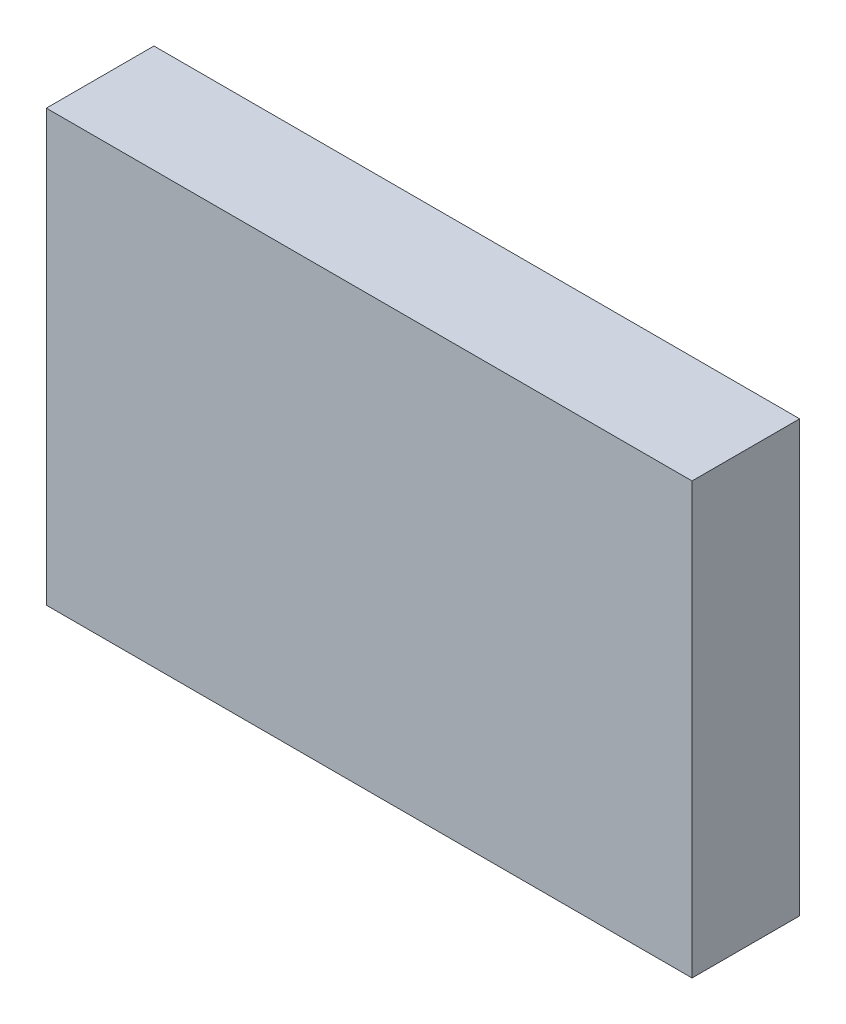
ISO-10303-21;
HEADER;
FILE_DESCRIPTION(('STEP AP214'),'2;1');
FILE_NAME('part.step','',(''),(''),'','','');
FILE_SCHEMA(('AUTOMOTIVE_DESIGN { 1 0 10303 214 1 1 1 1 }'));
ENDSEC;
DATA;
#1=APPLICATION_CONTEXT('core data for automotive mechanical design processes');
#2=APPLICATION_PROTOCOL_DEFINITION('international standard','automotive_design',2000,#1);
#3=PRODUCT_CONTEXT('',#1,'mechanical');
#4=PRODUCT('Part','Part','',(#3));
#5=PRODUCT_RELATED_PRODUCT_CATEGORY('part','',(#4));
#6=PRODUCT_DEFINITION_FORMATION('','',#4);
#7=PRODUCT_DEFINITION_CONTEXT('part definition',#1,'design');
#8=PRODUCT_DEFINITION('design','',#6,#7);
#9=PRODUCT_DEFINITION_SHAPE('','',#8);
#10=(LENGTH_UNIT() NAMED_UNIT(*) SI_UNIT(.MILLI.,.METRE.));
#11=(NAMED_UNIT(*) PLANE_ANGLE_UNIT() SI_UNIT($,.RADIAN.));
#12=(NAMED_UNIT(*) SI_UNIT($,.STERADIAN.) SOLID_ANGLE_UNIT());
#13=UNCERTAINTY_MEASURE_WITH_UNIT(LENGTH_MEASURE(1.E-05),#10,'distance_accuracy_value','');
#14=(GEOMETRIC_REPRESENTATION_CONTEXT(3) GLOBAL_UNCERTAINTY_ASSIGNED_CONTEXT((#13)) GLOBAL_UNIT_ASSIGNED_CONTEXT((#10,
#11,#12)) REPRESENTATION_CONTEXT('',''));
#15=CARTESIAN_POINT('',(0.,0.,0.));
#16=DIRECTION('',(0.,0.,1.));
#17=DIRECTION('',(1.,0.,0.));
#18=AXIS2_PLACEMENT_3D('',#15,#16,#17);
#19=CARTESIAN_POINT('',(45.,62.7661427447184,15.));
#20=DIRECTION('',(-1.,0.,0.));
#21=DIRECTION('',(0.,0.,1.));
#22=AXIS2_PLACEMENT_3D('',#19,#20,#21);
#23=PLANE('',#22);
#24=DIRECTION('',(0.,1.,0.));
#25=VECTOR('',#24,1.);
#26=CARTESIAN_POINT('',(45.,62.7661427447184,0.));
#27=LINE('',#26,#25);
#28=CARTESIAN_POINT('',(45.,2.76614274471837,0.));
#29=VERTEX_POINT('',#28);
#30=CARTESIAN_POINT('',(45.,62.7661427447184,0.));
#31=VERTEX_POINT('',#30);
#32=EDGE_CURVE('E98',#29,#31,#27,.T.);
#33=ORIENTED_EDGE('',*,*,#32,.T.);
#34=DIRECTION('',(0.,0.,-1.));
#35=VECTOR('',#34,1.);
#36=CARTESIAN_POINT('',(45.,62.7661427447184,15.));
#37=LINE('',#36,#35);
#38=CARTESIAN_POINT('',(45.,62.7661427447184,15.));
#39=VERTEX_POINT('',#38);
#40=EDGE_CURVE('E11',#39,#31,#37,.T.);
#41=ORIENTED_EDGE('',*,*,#40,.F.);
#42=DIRECTION('',(0.,1.,0.));
#43=VECTOR('',#42,1.);
#44=CARTESIAN_POINT('',(45.,62.7661427447184,15.));
#45=LINE('',#44,#43);
#46=CARTESIAN_POINT('',(45.,2.76614274471837,15.));
#47=VERTEX_POINT('',#46);
#48=EDGE_CURVE('E86',#47,#39,#45,.T.);
#49=ORIENTED_EDGE('',*,*,#48,.F.);
#50=DIRECTION('',(0.,0.,-1.));
#51=VECTOR('',#50,1.);
#52=CARTESIAN_POINT('',(45.,2.76614274471837,15.));
#53=LINE('',#52,#51);
#54=EDGE_CURVE('E94',#47,#29,#53,.T.);
#55=ORIENTED_EDGE('',*,*,#54,.T.);
#56=EDGE_LOOP('',(#33,#41,#49,#55));
#57=FACE_BOUND('',#56,.T.);
#58=ADVANCED_FACE('F35',(#57),#23,.F.);
#59=CARTESIAN_POINT('',(-45.,62.7661427447184,15.));
#60=DIRECTION('',(0.,-1.,0.));
#61=DIRECTION('',(0.,0.,-1.));
#62=AXIS2_PLACEMENT_3D('',#59,#60,#61);
#63=PLANE('',#62);
#64=DIRECTION('',(-1.,0.,0.));
#65=VECTOR('',#64,1.);
#66=CARTESIAN_POINT('',(-45.,62.7661427447184,0.));
#67=LINE('',#66,#65);
#68=CARTESIAN_POINT('',(-45.,62.7661427447184,0.));
#69=VERTEX_POINT('',#68);
#70=EDGE_CURVE('E90',#31,#69,#67,.T.);
#71=ORIENTED_EDGE('',*,*,#70,.T.);
#72=DIRECTION('',(0.,0.,-1.));
#73=VECTOR('',#72,1.);
#74=CARTESIAN_POINT('',(-45.,62.7661427447184,15.));
#75=LINE('',#74,#73);
#76=CARTESIAN_POINT('',(-45.,62.7661427447184,15.));
#77=VERTEX_POINT('',#76);
#78=EDGE_CURVE('E43',#77,#69,#75,.T.);
#79=ORIENTED_EDGE('',*,*,#78,.F.);
#80=DIRECTION('',(-1.,0.,0.));
#81=VECTOR('',#80,1.);
#82=CARTESIAN_POINT('',(-45.,62.7661427447184,15.));
#83=LINE('',#82,#81);
#84=EDGE_CURVE('E81',#39,#77,#83,.T.);
#85=ORIENTED_EDGE('',*,*,#84,.F.);
#86=ORIENTED_EDGE('',*,*,#40,.T.);
#87=EDGE_LOOP('',(#71,#79,#85,#86));
#88=FACE_BOUND('',#87,.T.);
#89=ADVANCED_FACE('F89',(#88),#63,.F.);
#90=CARTESIAN_POINT('',(-45.,62.7661427447184,15.));
#91=DIRECTION('',(1.,0.,0.));
#92=DIRECTION('',(0.,0.,-1.));
#93=AXIS2_PLACEMENT_3D('',#90,#91,#92);
#94=PLANE('',#93);
#95=DIRECTION('',(0.,-1.,0.));
#96=VECTOR('',#95,1.);
#97=CARTESIAN_POINT('',(-45.,62.7661427447184,0.));
#98=LINE('',#97,#96);
#99=CARTESIAN_POINT('',(-45.,2.76614274471837,0.));
#100=VERTEX_POINT('',#99);
#101=EDGE_CURVE('E68',#69,#100,#98,.T.);
#102=ORIENTED_EDGE('',*,*,#101,.T.);
#103=DIRECTION('',(0.,0.,-1.));
#104=VECTOR('',#103,1.);
#105=CARTESIAN_POINT('',(-45.,2.76614274471837,15.));
#106=LINE('',#105,#104);
#107=CARTESIAN_POINT('',(-45.,2.76614274471837,15.));
#108=VERTEX_POINT('',#107);
#109=EDGE_CURVE('E91',#108,#100,#106,.T.);
#110=ORIENTED_EDGE('',*,*,#109,.F.);
#111=DIRECTION('',(0.,-1.,0.));
#112=VECTOR('',#111,1.);
#113=CARTESIAN_POINT('',(-45.,62.7661427447184,15.));
#114=LINE('',#113,#112);
#115=EDGE_CURVE('E84',#77,#108,#114,.T.);
#116=ORIENTED_EDGE('',*,*,#115,.F.);
#117=ORIENTED_EDGE('',*,*,#78,.T.);
#118=EDGE_LOOP('',(#102,#110,#116,#117));
#119=FACE_BOUND('',#118,.T.);
#120=ADVANCED_FACE('F92',(#119),#94,.F.);
#121=CARTESIAN_POINT('',(-45.,2.76614274471837,15.));
#122=DIRECTION('',(0.,1.,0.));
#123=DIRECTION('',(0.,0.,1.));
#124=AXIS2_PLACEMENT_3D('',#121,#122,#123);
#125=PLANE('',#124);
#126=DIRECTION('',(1.,0.,0.));
#127=VECTOR('',#126,1.);
#128=CARTESIAN_POINT('',(-45.,2.76614274471837,0.));
#129=LINE('',#128,#127);
#130=EDGE_CURVE('E74',#100,#29,#129,.T.);
#131=ORIENTED_EDGE('',*,*,#130,.T.);
#132=ORIENTED_EDGE('',*,*,#54,.F.);
#133=DIRECTION('',(1.,0.,0.));
#134=VECTOR('',#133,1.);
#135=CARTESIAN_POINT('',(-45.,2.76614274471837,15.));
#136=LINE('',#135,#134);
#137=EDGE_CURVE('E51',#108,#47,#136,.T.);
#138=ORIENTED_EDGE('',*,*,#137,.F.);
#139=ORIENTED_EDGE('',*,*,#109,.T.);
#140=EDGE_LOOP('',(#131,#132,#138,#139));
#141=FACE_BOUND('',#140,.T.);
#142=ADVANCED_FACE('F105',(#141),#125,.F.);
#143=CARTESIAN_POINT('',(0.,0.,15.));
#144=DIRECTION('',(0.,0.,1.));
#145=DIRECTION('',(1.,0.,0.));
#146=AXIS2_PLACEMENT_3D('',#143,#144,#145);
#147=PLANE('',#146);
#148=ORIENTED_EDGE('',*,*,#48,.T.);
#149=ORIENTED_EDGE('',*,*,#84,.T.);
#150=ORIENTED_EDGE('',*,*,#115,.T.);
#151=ORIENTED_EDGE('',*,*,#137,.T.);
#152=EDGE_LOOP('',(#148,#149,#150,#151));
#153=FACE_BOUND('',#152,.T.);
#154=ADVANCED_FACE('F82',(#153),#147,.T.);
#155=CARTESIAN_POINT('',(0.,0.,0.));
#156=DIRECTION('',(0.,0.,1.));
#157=DIRECTION('',(1.,0.,0.));
#158=AXIS2_PLACEMENT_3D('',#155,#156,#157);
#159=PLANE('',#158);
#160=ORIENTED_EDGE('',*,*,#32,.F.);
#161=ORIENTED_EDGE('',*,*,#130,.F.);
#162=ORIENTED_EDGE('',*,*,#101,.F.);
#163=ORIENTED_EDGE('',*,*,#70,.F.);
#164=EDGE_LOOP('',(#160,#161,#162,#163));
#165=FACE_BOUND('',#164,.T.);
#166=ADVANCED_FACE('F108',(#165),#159,.F.);
#167=CLOSED_SHELL('',(#58,#89,#120,#142,#154,#166));
#168=MANIFOLD_SOLID_BREP('B2',#167);
#169=ADVANCED_BREP_SHAPE_REPRESENTATION('',(#18,#168),#14);
#170=SHAPE_DEFINITION_REPRESENTATION(#9,#169);
ENDSEC;
END-ISO-10303-21;
